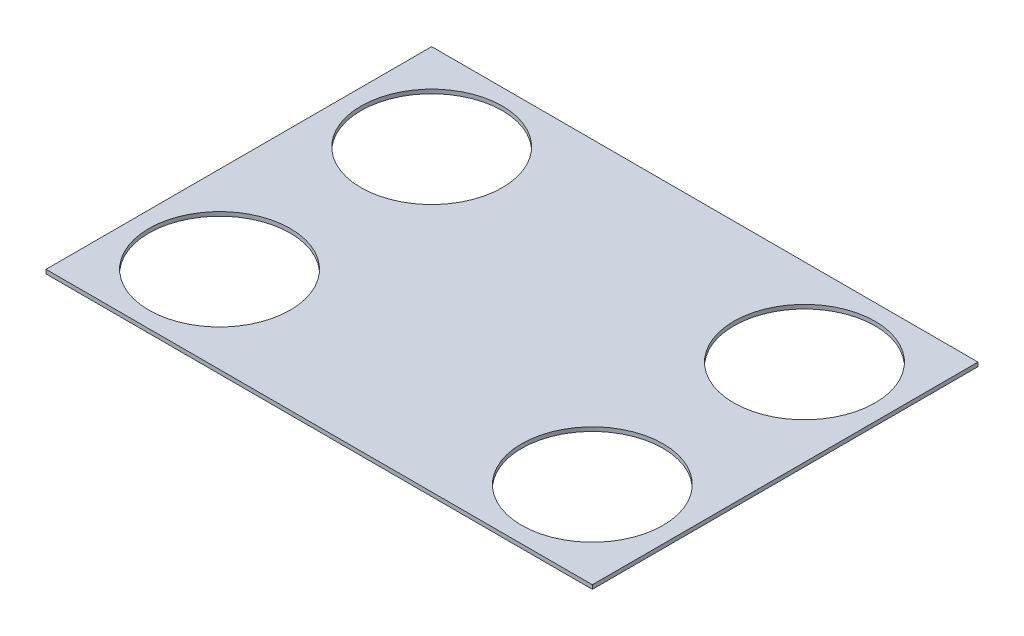
ISO-10303-21;
HEADER;
FILE_DESCRIPTION(('STEP AP214'),'2;1');
FILE_NAME('part.step','',(''),(''),'','','');
FILE_SCHEMA(('AUTOMOTIVE_DESIGN { 1 0 10303 214 1 1 1 1 }'));
ENDSEC;
DATA;
#1=APPLICATION_CONTEXT('core data for automotive mechanical design processes');
#2=APPLICATION_PROTOCOL_DEFINITION('international standard','automotive_design',2000,#1);
#3=PRODUCT_CONTEXT('',#1,'mechanical');
#4=PRODUCT('Part','Part','',(#3));
#5=PRODUCT_RELATED_PRODUCT_CATEGORY('part','',(#4));
#6=PRODUCT_DEFINITION_FORMATION('','',#4);
#7=PRODUCT_DEFINITION_CONTEXT('part definition',#1,'design');
#8=PRODUCT_DEFINITION('design','',#6,#7);
#9=PRODUCT_DEFINITION_SHAPE('','',#8);
#10=(LENGTH_UNIT() NAMED_UNIT(*) SI_UNIT(.MILLI.,.METRE.));
#11=(NAMED_UNIT(*) PLANE_ANGLE_UNIT() SI_UNIT($,.RADIAN.));
#12=(NAMED_UNIT(*) SI_UNIT($,.STERADIAN.) SOLID_ANGLE_UNIT());
#13=UNCERTAINTY_MEASURE_WITH_UNIT(LENGTH_MEASURE(1.E-05),#10,'distance_accuracy_value','');
#14=(GEOMETRIC_REPRESENTATION_CONTEXT(3) GLOBAL_UNCERTAINTY_ASSIGNED_CONTEXT((#13)) GLOBAL_UNIT_ASSIGNED_CONTEXT((#10,
#11,#12)) REPRESENTATION_CONTEXT('',''));
#15=CARTESIAN_POINT('',(0.,0.,0.));
#16=DIRECTION('',(0.,0.,1.));
#17=DIRECTION('',(1.,0.,0.));
#18=AXIS2_PLACEMENT_3D('',#15,#16,#17);
#19=CARTESIAN_POINT('',(0.,3.175,0.));
#20=DIRECTION('',(0.,-1.,0.));
#21=DIRECTION('',(0.,0.,-1.));
#22=AXIS2_PLACEMENT_3D('',#19,#20,#21);
#23=PLANE('',#22);
#24=CARTESIAN_POINT('',(363.22,3.175,-236.22));
#25=DIRECTION('',(0.,1.,0.));
#26=DIRECTION('',(0.,0.,1.));
#27=AXIS2_PLACEMENT_3D('',#24,#25,#26);
#28=CIRCLE('',#27,55.88);
#29=CARTESIAN_POINT('',(363.22,3.175,-180.34));
#30=VERTEX_POINT('',#29);
#31=EDGE_CURVE('E121',#30,#30,#28,.T.);
#32=ORIENTED_EDGE('',*,*,#31,.F.);
#33=EDGE_LOOP('',(#32));
#34=FACE_BOUND('',#33,.T.);
#35=CARTESIAN_POINT('',(68.58,3.175,-68.58));
#36=DIRECTION('',(0.,1.,0.));
#37=DIRECTION('',(0.,0.,1.));
#38=AXIS2_PLACEMENT_3D('',#35,#36,#37);
#39=CIRCLE('',#38,55.88);
#40=CARTESIAN_POINT('',(68.58,3.175,-12.7));
#41=VERTEX_POINT('',#40);
#42=EDGE_CURVE('E100',#41,#41,#39,.T.);
#43=ORIENTED_EDGE('',*,*,#42,.F.);
#44=EDGE_LOOP('',(#43));
#45=FACE_BOUND('',#44,.T.);
#46=DIRECTION('',(0.,0.,1.));
#47=VECTOR('',#46,1.);
#48=CARTESIAN_POINT('',(0.,3.175,0.));
#49=LINE('',#48,#47);
#50=CARTESIAN_POINT('',(0.,3.175,-304.8));
#51=VERTEX_POINT('',#50);
#52=CARTESIAN_POINT('',(0.,3.175,0.));
#53=VERTEX_POINT('',#52);
#54=EDGE_CURVE('E85',#51,#53,#49,.T.);
#55=ORIENTED_EDGE('',*,*,#54,.T.);
#56=DIRECTION('',(1.,0.,0.));
#57=VECTOR('',#56,1.);
#58=CARTESIAN_POINT('',(0.,3.175,0.));
#59=LINE('',#58,#57);
#60=CARTESIAN_POINT('',(431.8,3.175,0.));
#61=VERTEX_POINT('',#60);
#62=EDGE_CURVE('E80',#53,#61,#59,.T.);
#63=ORIENTED_EDGE('',*,*,#62,.T.);
#64=DIRECTION('',(0.,0.,-1.));
#65=VECTOR('',#64,1.);
#66=CARTESIAN_POINT('',(431.8,3.175,0.));
#67=LINE('',#66,#65);
#68=CARTESIAN_POINT('',(431.8,3.175,-304.8));
#69=VERTEX_POINT('',#68);
#70=EDGE_CURVE('E83',#61,#69,#67,.T.);
#71=ORIENTED_EDGE('',*,*,#70,.T.);
#72=DIRECTION('',(-1.,0.,0.));
#73=VECTOR('',#72,1.);
#74=CARTESIAN_POINT('',(0.,3.175,-304.8));
#75=LINE('',#74,#73);
#76=EDGE_CURVE('E50',#69,#51,#75,.T.);
#77=ORIENTED_EDGE('',*,*,#76,.T.);
#78=EDGE_LOOP('',(#55,#63,#71,#77));
#79=FACE_BOUND('',#78,.T.);
#80=CARTESIAN_POINT('',(363.22,3.175,-68.58));
#81=DIRECTION('',(0.,1.,0.));
#82=DIRECTION('',(0.,0.,1.));
#83=AXIS2_PLACEMENT_3D('',#80,#81,#82);
#84=CIRCLE('',#83,55.8800000000001);
#85=CARTESIAN_POINT('',(363.22,3.175,-12.6999999999999));
#86=VERTEX_POINT('',#85);
#87=EDGE_CURVE('E115',#86,#86,#84,.T.);
#88=ORIENTED_EDGE('',*,*,#87,.F.);
#89=EDGE_LOOP('',(#88));
#90=FACE_BOUND('',#89,.T.);
#91=CARTESIAN_POINT('',(68.58,3.175,-236.22));
#92=DIRECTION('',(0.,1.,0.));
#93=DIRECTION('',(0.,0.,1.));
#94=AXIS2_PLACEMENT_3D('',#91,#92,#93);
#95=CIRCLE('',#94,55.88);
#96=CARTESIAN_POINT('',(68.58,3.175,-180.34));
#97=VERTEX_POINT('',#96);
#98=EDGE_CURVE('E127',#97,#97,#95,.T.);
#99=ORIENTED_EDGE('',*,*,#98,.F.);
#100=EDGE_LOOP('',(#99));
#101=FACE_BOUND('',#100,.T.);
#102=ADVANCED_FACE('F33',(#34,#45,#79,#90,#101),#23,.F.);
#103=CARTESIAN_POINT('',(0.,0.,0.));
#104=DIRECTION('',(0.,-1.,0.));
#105=DIRECTION('',(0.,0.,-1.));
#106=AXIS2_PLACEMENT_3D('',#103,#104,#105);
#107=PLANE('',#106);
#108=CARTESIAN_POINT('',(363.22,0.,-236.22));
#109=DIRECTION('',(0.,1.,0.));
#110=DIRECTION('',(0.,0.,1.));
#111=AXIS2_PLACEMENT_3D('',#108,#109,#110);
#112=CIRCLE('',#111,55.88);
#113=CARTESIAN_POINT('',(363.22,0.,-180.34));
#114=VERTEX_POINT('',#113);
#115=EDGE_CURVE('E124',#114,#114,#112,.T.);
#116=ORIENTED_EDGE('',*,*,#115,.T.);
#117=EDGE_LOOP('',(#116));
#118=FACE_BOUND('',#117,.T.);
#119=CARTESIAN_POINT('',(68.58,0.,-68.58));
#120=DIRECTION('',(0.,1.,0.));
#121=DIRECTION('',(0.,0.,1.));
#122=AXIS2_PLACEMENT_3D('',#119,#120,#121);
#123=CIRCLE('',#122,55.88);
#124=CARTESIAN_POINT('',(68.58,0.,-12.7));
#125=VERTEX_POINT('',#124);
#126=EDGE_CURVE('E112',#125,#125,#123,.T.);
#127=ORIENTED_EDGE('',*,*,#126,.T.);
#128=EDGE_LOOP('',(#127));
#129=FACE_BOUND('',#128,.T.);
#130=DIRECTION('',(0.,0.,1.));
#131=VECTOR('',#130,1.);
#132=CARTESIAN_POINT('',(0.,0.,0.));
#133=LINE('',#132,#131);
#134=CARTESIAN_POINT('',(0.,0.,-304.8));
#135=VERTEX_POINT('',#134);
#136=CARTESIAN_POINT('',(0.,0.,0.));
#137=VERTEX_POINT('',#136);
#138=EDGE_CURVE('E97',#135,#137,#133,.T.);
#139=ORIENTED_EDGE('',*,*,#138,.F.);
#140=DIRECTION('',(-1.,0.,0.));
#141=VECTOR('',#140,1.);
#142=CARTESIAN_POINT('',(0.,0.,-304.8));
#143=LINE('',#142,#141);
#144=CARTESIAN_POINT('',(431.8,0.,-304.8));
#145=VERTEX_POINT('',#144);
#146=EDGE_CURVE('E73',#145,#135,#143,.T.);
#147=ORIENTED_EDGE('',*,*,#146,.F.);
#148=DIRECTION('',(0.,0.,-1.));
#149=VECTOR('',#148,1.);
#150=CARTESIAN_POINT('',(431.8,0.,0.));
#151=LINE('',#150,#149);
#152=CARTESIAN_POINT('',(431.8,0.,0.));
#153=VERTEX_POINT('',#152);
#154=EDGE_CURVE('E67',#153,#145,#151,.T.);
#155=ORIENTED_EDGE('',*,*,#154,.F.);
#156=DIRECTION('',(1.,0.,0.));
#157=VECTOR('',#156,1.);
#158=CARTESIAN_POINT('',(0.,0.,0.));
#159=LINE('',#158,#157);
#160=EDGE_CURVE('E89',#137,#153,#159,.T.);
#161=ORIENTED_EDGE('',*,*,#160,.F.);
#162=EDGE_LOOP('',(#139,#147,#155,#161));
#163=FACE_BOUND('',#162,.T.);
#164=CARTESIAN_POINT('',(363.22,0.,-68.58));
#165=DIRECTION('',(0.,1.,0.));
#166=DIRECTION('',(0.,0.,1.));
#167=AXIS2_PLACEMENT_3D('',#164,#165,#166);
#168=CIRCLE('',#167,55.8800000000001);
#169=CARTESIAN_POINT('',(363.22,0.,-12.6999999999999));
#170=VERTEX_POINT('',#169);
#171=EDGE_CURVE('E118',#170,#170,#168,.T.);
#172=ORIENTED_EDGE('',*,*,#171,.T.);
#173=EDGE_LOOP('',(#172));
#174=FACE_BOUND('',#173,.T.);
#175=CARTESIAN_POINT('',(68.58,0.,-236.22));
#176=DIRECTION('',(0.,1.,0.));
#177=DIRECTION('',(0.,0.,1.));
#178=AXIS2_PLACEMENT_3D('',#175,#176,#177);
#179=CIRCLE('',#178,55.88);
#180=CARTESIAN_POINT('',(68.58,0.,-180.34));
#181=VERTEX_POINT('',#180);
#182=EDGE_CURVE('E130',#181,#181,#179,.T.);
#183=ORIENTED_EDGE('',*,*,#182,.T.);
#184=EDGE_LOOP('',(#183));
#185=FACE_BOUND('',#184,.T.);
#186=ADVANCED_FACE('F108',(#118,#129,#163,#174,#185),#107,.T.);
#187=CARTESIAN_POINT('',(0.,3.175,0.));
#188=DIRECTION('',(1.,0.,0.));
#189=DIRECTION('',(0.,0.,-1.));
#190=AXIS2_PLACEMENT_3D('',#187,#188,#189);
#191=PLANE('',#190);
#192=ORIENTED_EDGE('',*,*,#138,.T.);
#193=DIRECTION('',(0.,-1.,0.));
#194=VECTOR('',#193,1.);
#195=CARTESIAN_POINT('',(0.,3.175,0.));
#196=LINE('',#195,#194);
#197=EDGE_CURVE('E11',#53,#137,#196,.T.);
#198=ORIENTED_EDGE('',*,*,#197,.F.);
#199=ORIENTED_EDGE('',*,*,#54,.F.);
#200=DIRECTION('',(0.,-1.,0.));
#201=VECTOR('',#200,1.);
#202=CARTESIAN_POINT('',(0.,3.175,-304.8));
#203=LINE('',#202,#201);
#204=EDGE_CURVE('E93',#51,#135,#203,.T.);
#205=ORIENTED_EDGE('',*,*,#204,.T.);
#206=EDGE_LOOP('',(#192,#198,#199,#205));
#207=FACE_BOUND('',#206,.T.);
#208=ADVANCED_FACE('F35',(#207),#191,.F.);
#209=CARTESIAN_POINT('',(0.,3.175,0.));
#210=DIRECTION('',(0.,0.,-1.));
#211=DIRECTION('',(-1.,0.,0.));
#212=AXIS2_PLACEMENT_3D('',#209,#210,#211);
#213=PLANE('',#212);
#214=ORIENTED_EDGE('',*,*,#160,.T.);
#215=DIRECTION('',(0.,-1.,0.));
#216=VECTOR('',#215,1.);
#217=CARTESIAN_POINT('',(431.8,3.175,0.));
#218=LINE('',#217,#216);
#219=EDGE_CURVE('E42',#61,#153,#218,.T.);
#220=ORIENTED_EDGE('',*,*,#219,.F.);
#221=ORIENTED_EDGE('',*,*,#62,.F.);
#222=ORIENTED_EDGE('',*,*,#197,.T.);
#223=EDGE_LOOP('',(#214,#220,#221,#222));
#224=FACE_BOUND('',#223,.T.);
#225=ADVANCED_FACE('F88',(#224),#213,.F.);
#226=CARTESIAN_POINT('',(431.8,3.175,0.));
#227=DIRECTION('',(-1.,0.,0.));
#228=DIRECTION('',(0.,0.,1.));
#229=AXIS2_PLACEMENT_3D('',#226,#227,#228);
#230=PLANE('',#229);
#231=ORIENTED_EDGE('',*,*,#154,.T.);
#232=DIRECTION('',(0.,-1.,0.));
#233=VECTOR('',#232,1.);
#234=CARTESIAN_POINT('',(431.8,3.175,-304.8));
#235=LINE('',#234,#233);
#236=EDGE_CURVE('E90',#69,#145,#235,.T.);
#237=ORIENTED_EDGE('',*,*,#236,.F.);
#238=ORIENTED_EDGE('',*,*,#70,.F.);
#239=ORIENTED_EDGE('',*,*,#219,.T.);
#240=EDGE_LOOP('',(#231,#237,#238,#239));
#241=FACE_BOUND('',#240,.T.);
#242=ADVANCED_FACE('F91',(#241),#230,.F.);
#243=CARTESIAN_POINT('',(0.,3.175,-304.8));
#244=DIRECTION('',(0.,0.,1.));
#245=DIRECTION('',(1.,0.,0.));
#246=AXIS2_PLACEMENT_3D('',#243,#244,#245);
#247=PLANE('',#246);
#248=ORIENTED_EDGE('',*,*,#146,.T.);
#249=ORIENTED_EDGE('',*,*,#204,.F.);
#250=ORIENTED_EDGE('',*,*,#76,.F.);
#251=ORIENTED_EDGE('',*,*,#236,.T.);
#252=EDGE_LOOP('',(#248,#249,#250,#251));
#253=FACE_BOUND('',#252,.T.);
#254=ADVANCED_FACE('F105',(#253),#247,.F.);
#255=CARTESIAN_POINT('',(68.58,3.175,-68.58));
#256=DIRECTION('',(0.,-1.,0.));
#257=DIRECTION('',(0.,0.,-1.));
#258=AXIS2_PLACEMENT_3D('',#255,#256,#257);
#259=CYLINDRICAL_SURFACE('',#258,55.88);
#260=ORIENTED_EDGE('',*,*,#42,.T.);
#261=EDGE_LOOP('',(#260));
#262=FACE_BOUND('',#261,.T.);
#263=ORIENTED_EDGE('',*,*,#126,.F.);
#264=EDGE_LOOP('',(#263));
#265=FACE_BOUND('',#264,.T.);
#266=ADVANCED_FACE('F150',(#262,#265),#259,.F.);
#267=CARTESIAN_POINT('',(363.22,3.175,-68.58));
#268=DIRECTION('',(0.,-1.,0.));
#269=DIRECTION('',(0.,0.,-1.));
#270=AXIS2_PLACEMENT_3D('',#267,#268,#269);
#271=CYLINDRICAL_SURFACE('',#270,55.8800000000001);
#272=ORIENTED_EDGE('',*,*,#87,.T.);
#273=EDGE_LOOP('',(#272));
#274=FACE_BOUND('',#273,.T.);
#275=ORIENTED_EDGE('',*,*,#171,.F.);
#276=EDGE_LOOP('',(#275));
#277=FACE_BOUND('',#276,.T.);
#278=ADVANCED_FACE('F196',(#274,#277),#271,.F.);
#279=CARTESIAN_POINT('',(363.22,3.175,-236.22));
#280=DIRECTION('',(0.,-1.,0.));
#281=DIRECTION('',(0.,0.,-1.));
#282=AXIS2_PLACEMENT_3D('',#279,#280,#281);
#283=CYLINDRICAL_SURFACE('',#282,55.88);
#284=ORIENTED_EDGE('',*,*,#31,.T.);
#285=EDGE_LOOP('',(#284));
#286=FACE_BOUND('',#285,.T.);
#287=ORIENTED_EDGE('',*,*,#115,.F.);
#288=EDGE_LOOP('',(#287));
#289=FACE_BOUND('',#288,.T.);
#290=ADVANCED_FACE('F204',(#286,#289),#283,.F.);
#291=CARTESIAN_POINT('',(68.58,3.175,-236.22));
#292=DIRECTION('',(0.,-1.,0.));
#293=DIRECTION('',(0.,0.,-1.));
#294=AXIS2_PLACEMENT_3D('',#291,#292,#293);
#295=CYLINDRICAL_SURFACE('',#294,55.88);
#296=ORIENTED_EDGE('',*,*,#98,.T.);
#297=EDGE_LOOP('',(#296));
#298=FACE_BOUND('',#297,.T.);
#299=ORIENTED_EDGE('',*,*,#182,.F.);
#300=EDGE_LOOP('',(#299));
#301=FACE_BOUND('',#300,.T.);
#302=ADVANCED_FACE('F136',(#298,#301),#295,.F.);
#303=CLOSED_SHELL('',(#102,#186,#208,#225,#242,#254,#266,#278,#290,#302));
#304=MANIFOLD_SOLID_BREP('B2',#303);
#305=ADVANCED_BREP_SHAPE_REPRESENTATION('',(#18,#304),#14);
#306=SHAPE_DEFINITION_REPRESENTATION(#9,#305);
ENDSEC;
END-ISO-10303-21;
